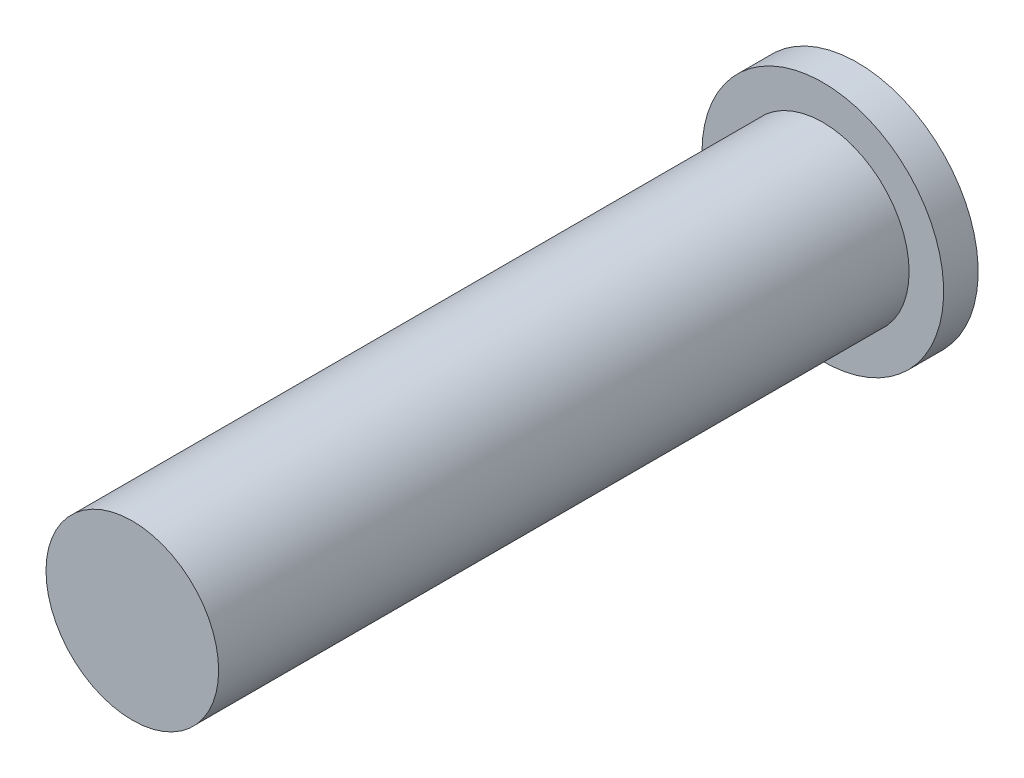
ISO-10303-21;
HEADER;
FILE_DESCRIPTION(('STEP AP214'),'2;1');
FILE_NAME('part.step','',(''),(''),'','','');
FILE_SCHEMA(('AUTOMOTIVE_DESIGN { 1 0 10303 214 1 1 1 1 }'));
ENDSEC;
DATA;
#1=APPLICATION_CONTEXT('core data for automotive mechanical design processes');
#2=APPLICATION_PROTOCOL_DEFINITION('international standard','automotive_design',2000,#1);
#3=PRODUCT_CONTEXT('',#1,'mechanical');
#4=PRODUCT('Part','Part','',(#3));
#5=PRODUCT_RELATED_PRODUCT_CATEGORY('part','',(#4));
#6=PRODUCT_DEFINITION_FORMATION('','',#4);
#7=PRODUCT_DEFINITION_CONTEXT('part definition',#1,'design');
#8=PRODUCT_DEFINITION('design','',#6,#7);
#9=PRODUCT_DEFINITION_SHAPE('','',#8);
#10=(LENGTH_UNIT() NAMED_UNIT(*) SI_UNIT(.MILLI.,.METRE.));
#11=(NAMED_UNIT(*) PLANE_ANGLE_UNIT() SI_UNIT($,.RADIAN.));
#12=(NAMED_UNIT(*) SI_UNIT($,.STERADIAN.) SOLID_ANGLE_UNIT());
#13=UNCERTAINTY_MEASURE_WITH_UNIT(LENGTH_MEASURE(1.E-05),#10,'distance_accuracy_value','');
#14=(GEOMETRIC_REPRESENTATION_CONTEXT(3) GLOBAL_UNCERTAINTY_ASSIGNED_CONTEXT((#13)) GLOBAL_UNIT_ASSIGNED_CONTEXT((#10,
#11,#12)) REPRESENTATION_CONTEXT('',''));
#15=CARTESIAN_POINT('',(0.,0.,0.));
#16=DIRECTION('',(0.,0.,1.));
#17=DIRECTION('',(1.,0.,0.));
#18=AXIS2_PLACEMENT_3D('',#15,#16,#17);
#19=CARTESIAN_POINT('',(0.,0.,40.));
#20=DIRECTION('',(0.,0.,-1.));
#21=DIRECTION('',(-1.,0.,0.));
#22=AXIS2_PLACEMENT_3D('',#19,#20,#21);
#23=CYLINDRICAL_SURFACE('',#22,5.);
#24=CARTESIAN_POINT('',(0.,0.,40.));
#25=DIRECTION('',(0.,0.,1.));
#26=DIRECTION('',(1.,0.,0.));
#27=AXIS2_PLACEMENT_3D('',#24,#25,#26);
#28=CIRCLE('',#27,5.);
#29=CARTESIAN_POINT('',(5.,0.,40.));
#30=VERTEX_POINT('',#29);
#31=EDGE_CURVE('E10',#30,#30,#28,.T.);
#32=ORIENTED_EDGE('',*,*,#31,.F.);
#33=EDGE_LOOP('',(#32));
#34=FACE_BOUND('',#33,.T.);
#35=CARTESIAN_POINT('',(0.,0.,0.));
#36=DIRECTION('',(0.,0.,1.));
#37=DIRECTION('',(1.,0.,0.));
#38=AXIS2_PLACEMENT_3D('',#35,#36,#37);
#39=CIRCLE('',#38,5.);
#40=CARTESIAN_POINT('',(5.,0.,0.));
#41=VERTEX_POINT('',#40);
#42=EDGE_CURVE('E34',#41,#41,#39,.T.);
#43=ORIENTED_EDGE('',*,*,#42,.T.);
#44=EDGE_LOOP('',(#43));
#45=FACE_BOUND('',#44,.T.);
#46=ADVANCED_FACE('F31',(#34,#45),#23,.T.);
#47=CARTESIAN_POINT('',(0.,0.,40.));
#48=DIRECTION('',(0.,0.,1.));
#49=DIRECTION('',(1.,0.,0.));
#50=AXIS2_PLACEMENT_3D('',#47,#48,#49);
#51=PLANE('',#50);
#52=ORIENTED_EDGE('',*,*,#31,.T.);
#53=EDGE_LOOP('',(#52));
#54=FACE_BOUND('',#53,.T.);
#55=ADVANCED_FACE('F54',(#54),#51,.T.);
#56=CARTESIAN_POINT('',(0.,0.,-2.));
#57=DIRECTION('',(0.,0.,1.));
#58=DIRECTION('',(1.,0.,0.));
#59=AXIS2_PLACEMENT_3D('',#56,#57,#58);
#60=CYLINDRICAL_SURFACE('',#59,7.);
#61=CARTESIAN_POINT('',(0.,0.,-2.));
#62=DIRECTION('',(0.,0.,-1.));
#63=DIRECTION('',(-1.,0.,0.));
#64=AXIS2_PLACEMENT_3D('',#61,#62,#63);
#65=CIRCLE('',#64,7.);
#66=CARTESIAN_POINT('',(-7.,0.,-2.));
#67=VERTEX_POINT('',#66);
#68=EDGE_CURVE('E41',#67,#67,#65,.T.);
#69=ORIENTED_EDGE('',*,*,#68,.F.);
#70=EDGE_LOOP('',(#69));
#71=FACE_BOUND('',#70,.T.);
#72=CARTESIAN_POINT('',(0.,0.,0.));
#73=DIRECTION('',(0.,0.,-1.));
#74=DIRECTION('',(-1.,0.,0.));
#75=AXIS2_PLACEMENT_3D('',#72,#73,#74);
#76=CIRCLE('',#75,7.);
#77=CARTESIAN_POINT('',(-7.,0.,0.));
#78=VERTEX_POINT('',#77);
#79=EDGE_CURVE('E43',#78,#78,#76,.T.);
#80=ORIENTED_EDGE('',*,*,#79,.T.);
#81=EDGE_LOOP('',(#80));
#82=FACE_BOUND('',#81,.T.);
#83=ADVANCED_FACE('F51',(#71,#82),#60,.T.);
#84=CARTESIAN_POINT('',(0.,0.,-2.));
#85=DIRECTION('',(0.,0.,-1.));
#86=DIRECTION('',(-1.,0.,0.));
#87=AXIS2_PLACEMENT_3D('',#84,#85,#86);
#88=PLANE('',#87);
#89=ORIENTED_EDGE('',*,*,#68,.T.);
#90=EDGE_LOOP('',(#89));
#91=FACE_BOUND('',#90,.T.);
#92=ADVANCED_FACE('F49',(#91),#88,.T.);
#93=CARTESIAN_POINT('',(0.,0.,0.));
#94=DIRECTION('',(0.,0.,-1.));
#95=DIRECTION('',(-1.,0.,0.));
#96=AXIS2_PLACEMENT_3D('',#93,#94,#95);
#97=PLANE('',#96);
#98=ORIENTED_EDGE('',*,*,#42,.F.);
#99=EDGE_LOOP('',(#98));
#100=FACE_BOUND('',#99,.T.);
#101=ORIENTED_EDGE('',*,*,#79,.F.);
#102=EDGE_LOOP('',(#101));
#103=FACE_BOUND('',#102,.T.);
#104=ADVANCED_FACE('F58',(#100,#103),#97,.F.);
#105=CLOSED_SHELL('',(#46,#55,#83,#92,#104));
#106=MANIFOLD_SOLID_BREP('B2',#105);
#107=ADVANCED_BREP_SHAPE_REPRESENTATION('',(#18,#106),#14);
#108=SHAPE_DEFINITION_REPRESENTATION(#9,#107);
ENDSEC;
END-ISO-10303-21;
